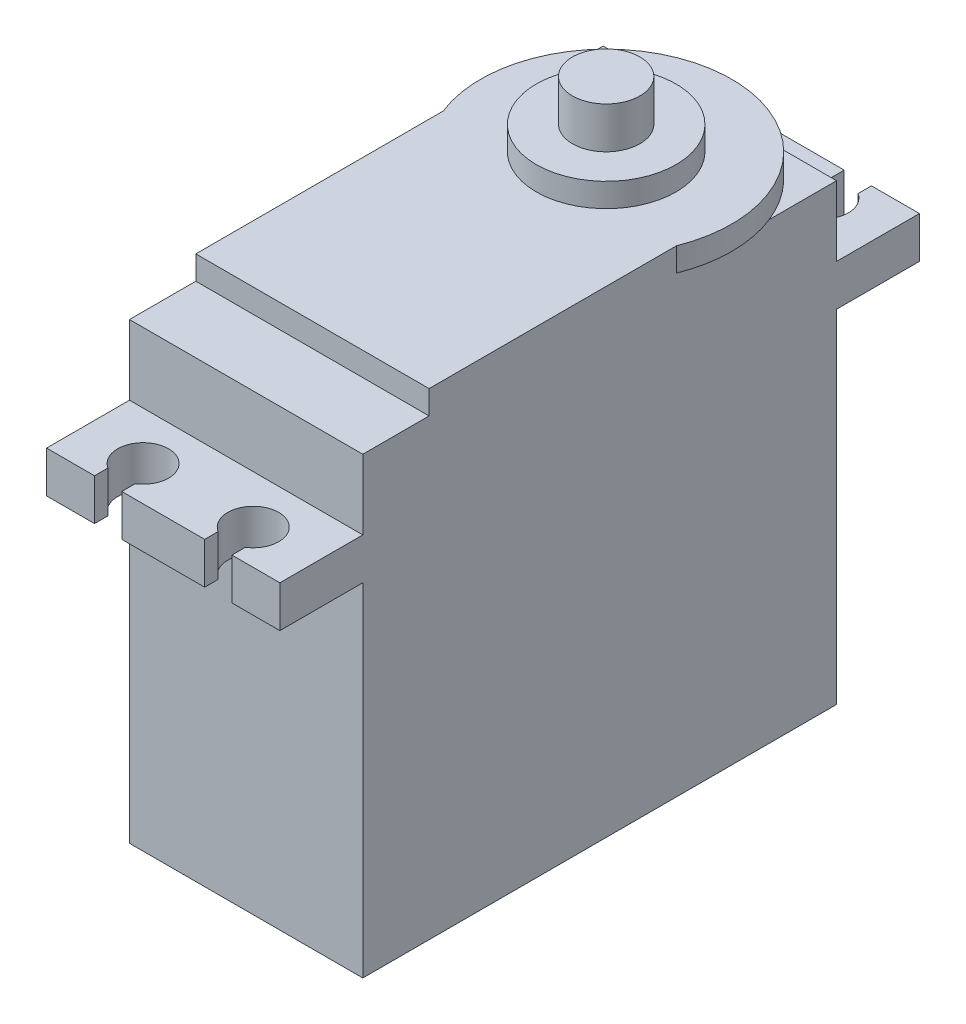
ISO-10303-21;
HEADER;
FILE_DESCRIPTION(('STEP AP214'),'2;1');
FILE_NAME('part.step','',(''),(''),'','','');
FILE_SCHEMA(('AUTOMOTIVE_DESIGN { 1 0 10303 214 1 1 1 1 }'));
ENDSEC;
DATA;
#1=APPLICATION_CONTEXT('core data for automotive mechanical design processes');
#2=APPLICATION_PROTOCOL_DEFINITION('international standard','automotive_design',2000,#1);
#3=PRODUCT_CONTEXT('',#1,'mechanical');
#4=PRODUCT('Part','Part','',(#3));
#5=PRODUCT_RELATED_PRODUCT_CATEGORY('part','',(#4));
#6=PRODUCT_DEFINITION_FORMATION('','',#4);
#7=PRODUCT_DEFINITION_CONTEXT('part definition',#1,'design');
#8=PRODUCT_DEFINITION('design','',#6,#7);
#9=PRODUCT_DEFINITION_SHAPE('','',#8);
#10=(LENGTH_UNIT() NAMED_UNIT(*) SI_UNIT(.MILLI.,.METRE.));
#11=(NAMED_UNIT(*) PLANE_ANGLE_UNIT() SI_UNIT($,.RADIAN.));
#12=(NAMED_UNIT(*) SI_UNIT($,.STERADIAN.) SOLID_ANGLE_UNIT());
#13=UNCERTAINTY_MEASURE_WITH_UNIT(LENGTH_MEASURE(1.E-05),#10,'distance_accuracy_value','');
#14=(GEOMETRIC_REPRESENTATION_CONTEXT(3) GLOBAL_UNCERTAINTY_ASSIGNED_CONTEXT((#13)) GLOBAL_UNIT_ASSIGNED_CONTEXT((#10,
#11,#12)) REPRESENTATION_CONTEXT('',''));
#15=CARTESIAN_POINT('',(0.,0.,0.));
#16=DIRECTION('',(0.,0.,1.));
#17=DIRECTION('',(1.,0.,0.));
#18=AXIS2_PLACEMENT_3D('',#15,#16,#17);
#19=CARTESIAN_POINT('',(19.7,0.,-40.));
#20=DIRECTION('',(0.,0.,1.));
#21=DIRECTION('',(1.,0.,0.));
#22=AXIS2_PLACEMENT_3D('',#19,#20,#21);
#23=PLANE('',#22);
#24=DIRECTION('',(1.,0.,0.));
#25=VECTOR('',#24,1.);
#26=CARTESIAN_POINT('',(0.,28.9,-40.));
#27=LINE('',#26,#25);
#28=CARTESIAN_POINT('',(0.,28.9,-40.));
#29=VERTEX_POINT('',#28);
#30=CARTESIAN_POINT('',(19.7,28.9,-40.));
#31=VERTEX_POINT('',#30);
#32=EDGE_CURVE('E66',#29,#31,#27,.T.);
#33=ORIENTED_EDGE('',*,*,#32,.T.);
#34=DIRECTION('',(0.,1.,0.));
#35=VECTOR('',#34,1.);
#36=CARTESIAN_POINT('',(19.7,0.,-40.));
#37=LINE('',#36,#35);
#38=CARTESIAN_POINT('',(19.7,0.,-40.));
#39=VERTEX_POINT('',#38);
#40=EDGE_CURVE('E290',#39,#31,#37,.T.);
#41=ORIENTED_EDGE('',*,*,#40,.F.);
#42=DIRECTION('',(-1.,0.,0.));
#43=VECTOR('',#42,1.);
#44=CARTESIAN_POINT('',(19.7,0.,-40.));
#45=LINE('',#44,#43);
#46=CARTESIAN_POINT('',(0.,0.,-40.));
#47=VERTEX_POINT('',#46);
#48=EDGE_CURVE('E527',#39,#47,#45,.T.);
#49=ORIENTED_EDGE('',*,*,#48,.T.);
#50=DIRECTION('',(0.,1.,0.));
#51=VECTOR('',#50,1.);
#52=CARTESIAN_POINT('',(0.,0.,-40.));
#53=LINE('',#52,#51);
#54=EDGE_CURVE('E515',#47,#29,#53,.T.);
#55=ORIENTED_EDGE('',*,*,#54,.T.);
#56=EDGE_LOOP('',(#33,#41,#49,#55));
#57=FACE_BOUND('',#56,.T.);
#58=ADVANCED_FACE('F41',(#57),#23,.F.);
#59=CARTESIAN_POINT('',(19.7,0.,0.));
#60=DIRECTION('',(0.,0.,-1.));
#61=DIRECTION('',(-1.,0.,0.));
#62=AXIS2_PLACEMENT_3D('',#59,#60,#61);
#63=PLANE('',#62);
#64=DIRECTION('',(-1.,0.,0.));
#65=VECTOR('',#64,1.);
#66=CARTESIAN_POINT('',(0.,32.4,0.));
#67=LINE('',#66,#65);
#68=CARTESIAN_POINT('',(19.7,32.4,0.));
#69=VERTEX_POINT('',#68);
#70=CARTESIAN_POINT('',(0.,32.4,0.));
#71=VERTEX_POINT('',#70);
#72=EDGE_CURVE('E372',#69,#71,#67,.T.);
#73=ORIENTED_EDGE('',*,*,#72,.F.);
#74=DIRECTION('',(0.,-1.,0.));
#75=VECTOR('',#74,1.);
#76=CARTESIAN_POINT('',(19.7,0.,0.));
#77=LINE('',#76,#75);
#78=CARTESIAN_POINT('',(19.7,38.3,0.));
#79=VERTEX_POINT('',#78);
#80=EDGE_CURVE('E497',#79,#69,#77,.T.);
#81=ORIENTED_EDGE('',*,*,#80,.F.);
#82=DIRECTION('',(-1.,0.,0.));
#83=VECTOR('',#82,1.);
#84=CARTESIAN_POINT('',(19.7,38.3,0.));
#85=LINE('',#84,#83);
#86=CARTESIAN_POINT('',(0.,38.3,0.));
#87=VERTEX_POINT('',#86);
#88=EDGE_CURVE('E507',#79,#87,#85,.T.);
#89=ORIENTED_EDGE('',*,*,#88,.T.);
#90=DIRECTION('',(0.,-1.,0.));
#91=VECTOR('',#90,1.);
#92=CARTESIAN_POINT('',(0.,0.,0.));
#93=LINE('',#92,#91);
#94=EDGE_CURVE('E509',#87,#71,#93,.T.);
#95=ORIENTED_EDGE('',*,*,#94,.T.);
#96=EDGE_LOOP('',(#73,#81,#89,#95));
#97=FACE_BOUND('',#96,.T.);
#98=ADVANCED_FACE('F570',(#97),#63,.F.);
#99=CARTESIAN_POINT('',(19.7,38.3,0.));
#100=DIRECTION('',(0.,-1.,0.));
#101=DIRECTION('',(0.,0.,-1.));
#102=AXIS2_PLACEMENT_3D('',#99,#100,#101);
#103=PLANE('',#102);
#104=CARTESIAN_POINT('',(9.85,38.3,-30.4));
#105=DIRECTION('',(0.,1.,0.));
#106=DIRECTION('',(0.,0.,1.));
#107=AXIS2_PLACEMENT_3D('',#104,#105,#106);
#108=CIRCLE('',#107,10.6);
#109=CARTESIAN_POINT('',(19.7,38.3,-34.3163120406832));
#110=VERTEX_POINT('',#109);
#111=CARTESIAN_POINT('',(14.3444410108488,38.3,-40.));
#112=VERTEX_POINT('',#111);
#113=EDGE_CURVE('E50',#110,#112,#108,.T.);
#114=ORIENTED_EDGE('',*,*,#113,.F.);
#115=DIRECTION('',(0.,0.,1.));
#116=VECTOR('',#115,1.);
#117=CARTESIAN_POINT('',(19.7,38.3,0.));
#118=LINE('',#117,#116);
#119=CARTESIAN_POINT('',(19.7,38.3,-40.));
#120=VERTEX_POINT('',#119);
#121=EDGE_CURVE('E504',#120,#110,#118,.T.);
#122=ORIENTED_EDGE('',*,*,#121,.F.);
#123=DIRECTION('',(-1.,0.,0.));
#124=VECTOR('',#123,1.);
#125=CARTESIAN_POINT('',(19.7,38.3,-40.));
#126=LINE('',#125,#124);
#127=EDGE_CURVE('E525',#120,#112,#126,.T.);
#128=ORIENTED_EDGE('',*,*,#127,.T.);
#129=EDGE_LOOP('',(#114,#122,#128));
#130=FACE_BOUND('',#129,.T.);
#131=ADVANCED_FACE('F624',(#130),#103,.F.);
#132=CARTESIAN_POINT('',(5.35555898915117,38.3,-40.));
#133=VERTEX_POINT('',#132);
#134=CARTESIAN_POINT('',(0.,38.3,-34.3163120406832));
#135=VERTEX_POINT('',#134);
#136=EDGE_CURVE('E484',#133,#135,#108,.T.);
#137=ORIENTED_EDGE('',*,*,#136,.F.);
#138=CARTESIAN_POINT('',(0.,38.3,-40.));
#139=VERTEX_POINT('',#138);
#140=EDGE_CURVE('E524',#133,#139,#126,.T.);
#141=ORIENTED_EDGE('',*,*,#140,.T.);
#142=DIRECTION('',(0.,0.,1.));
#143=VECTOR('',#142,1.);
#144=CARTESIAN_POINT('',(0.,38.3,0.));
#145=LINE('',#144,#143);
#146=EDGE_CURVE('E518',#139,#135,#145,.T.);
#147=ORIENTED_EDGE('',*,*,#146,.T.);
#148=EDGE_LOOP('',(#137,#141,#147));
#149=FACE_BOUND('',#148,.T.);
#150=ADVANCED_FACE('F638',(#149),#103,.F.);
#151=DIRECTION('',(1.,0.,0.));
#152=VECTOR('',#151,1.);
#153=CARTESIAN_POINT('',(0.,38.3,-5.6));
#154=LINE('',#153,#152);
#155=CARTESIAN_POINT('',(0.,38.3,-5.6));
#156=VERTEX_POINT('',#155);
#157=CARTESIAN_POINT('',(19.7,38.3,-5.6));
#158=VERTEX_POINT('',#157);
#159=EDGE_CURVE('E464',#156,#158,#154,.T.);
#160=ORIENTED_EDGE('',*,*,#159,.F.);
#161=EDGE_CURVE('E517',#156,#87,#145,.T.);
#162=ORIENTED_EDGE('',*,*,#161,.T.);
#163=ORIENTED_EDGE('',*,*,#88,.F.);
#164=EDGE_CURVE('E503',#158,#79,#118,.T.);
#165=ORIENTED_EDGE('',*,*,#164,.F.);
#166=EDGE_LOOP('',(#160,#162,#163,#165));
#167=FACE_BOUND('',#166,.T.);
#168=ADVANCED_FACE('F567',(#167),#103,.F.);
#169=CARTESIAN_POINT('',(19.7,28.9,0.));
#170=VERTEX_POINT('',#169);
#171=CARTESIAN_POINT('',(19.7,0.,0.));
#172=VERTEX_POINT('',#171);
#173=EDGE_CURVE('E500',#170,#172,#77,.T.);
#174=ORIENTED_EDGE('',*,*,#173,.F.);
#175=DIRECTION('',(-1.,0.,0.));
#176=VECTOR('',#175,1.);
#177=CARTESIAN_POINT('',(0.,28.9,0.));
#178=LINE('',#177,#176);
#179=CARTESIAN_POINT('',(0.,28.9,0.));
#180=VERTEX_POINT('',#179);
#181=EDGE_CURVE('E401',#170,#180,#178,.T.);
#182=ORIENTED_EDGE('',*,*,#181,.T.);
#183=CARTESIAN_POINT('',(0.,0.,0.));
#184=VERTEX_POINT('',#183);
#185=EDGE_CURVE('E496',#180,#184,#93,.T.);
#186=ORIENTED_EDGE('',*,*,#185,.T.);
#187=DIRECTION('',(-1.,0.,0.));
#188=VECTOR('',#187,1.);
#189=CARTESIAN_POINT('',(19.7,0.,0.));
#190=LINE('',#189,#188);
#191=EDGE_CURVE('E45',#172,#184,#190,.T.);
#192=ORIENTED_EDGE('',*,*,#191,.F.);
#193=EDGE_LOOP('',(#174,#182,#186,#192));
#194=FACE_BOUND('',#193,.T.);
#195=ADVANCED_FACE('F43',(#194),#63,.F.);
#196=CARTESIAN_POINT('',(19.7,0.,0.));
#197=DIRECTION('',(0.,1.,0.));
#198=DIRECTION('',(0.,0.,1.));
#199=AXIS2_PLACEMENT_3D('',#196,#197,#198);
#200=PLANE('',#199);
#201=DIRECTION('',(0.,0.,-1.));
#202=VECTOR('',#201,1.);
#203=CARTESIAN_POINT('',(0.,0.,0.));
#204=LINE('',#203,#202);
#205=EDGE_CURVE('E512',#184,#47,#204,.T.);
#206=ORIENTED_EDGE('',*,*,#205,.T.);
#207=ORIENTED_EDGE('',*,*,#48,.F.);
#208=DIRECTION('',(0.,0.,-1.));
#209=VECTOR('',#208,1.);
#210=CARTESIAN_POINT('',(19.7,0.,0.));
#211=LINE('',#210,#209);
#212=EDGE_CURVE('E499',#172,#39,#211,.T.);
#213=ORIENTED_EDGE('',*,*,#212,.F.);
#214=ORIENTED_EDGE('',*,*,#191,.T.);
#215=EDGE_LOOP('',(#206,#207,#213,#214));
#216=FACE_BOUND('',#215,.T.);
#217=ADVANCED_FACE('F617',(#216),#200,.F.);
#218=CARTESIAN_POINT('',(19.7,32.4,-40.));
#219=VERTEX_POINT('',#218);
#220=EDGE_CURVE('E58',#219,#120,#37,.T.);
#221=ORIENTED_EDGE('',*,*,#220,.F.);
#222=DIRECTION('',(1.,0.,0.));
#223=VECTOR('',#222,1.);
#224=CARTESIAN_POINT('',(0.,32.4,-40.));
#225=LINE('',#224,#223);
#226=CARTESIAN_POINT('',(0.,32.4,-40.));
#227=VERTEX_POINT('',#226);
#228=EDGE_CURVE('E320',#227,#219,#225,.T.);
#229=ORIENTED_EDGE('',*,*,#228,.F.);
#230=EDGE_CURVE('E514',#227,#139,#53,.T.);
#231=ORIENTED_EDGE('',*,*,#230,.T.);
#232=ORIENTED_EDGE('',*,*,#140,.F.);
#233=EDGE_CURVE('E528',#112,#133,#126,.T.);
#234=ORIENTED_EDGE('',*,*,#233,.F.);
#235=ORIENTED_EDGE('',*,*,#127,.F.);
#236=EDGE_LOOP('',(#221,#229,#231,#232,#234,#235));
#237=FACE_BOUND('',#236,.T.);
#238=ADVANCED_FACE('F620',(#237),#23,.F.);
#239=CARTESIAN_POINT('',(19.7,0.,0.));
#240=DIRECTION('',(-1.,0.,0.));
#241=DIRECTION('',(0.,0.,1.));
#242=AXIS2_PLACEMENT_3D('',#239,#240,#241);
#243=PLANE('',#242);
#244=ORIENTED_EDGE('',*,*,#80,.T.);
#245=DIRECTION('',(0.,0.,-1.));
#246=VECTOR('',#245,1.);
#247=CARTESIAN_POINT('',(19.7,32.4,0.));
#248=LINE('',#247,#246);
#249=CARTESIAN_POINT('',(19.7,32.4,7.));
#250=VERTEX_POINT('',#249);
#251=EDGE_CURVE('E434',#250,#69,#248,.T.);
#252=ORIENTED_EDGE('',*,*,#251,.F.);
#253=DIRECTION('',(0.,1.,0.));
#254=VECTOR('',#253,1.);
#255=CARTESIAN_POINT('',(19.7,28.9,7.));
#256=LINE('',#255,#254);
#257=CARTESIAN_POINT('',(19.7,28.9,7.));
#258=VERTEX_POINT('',#257);
#259=EDGE_CURVE('E438',#258,#250,#256,.T.);
#260=ORIENTED_EDGE('',*,*,#259,.F.);
#261=DIRECTION('',(0.,0.,-1.));
#262=VECTOR('',#261,1.);
#263=CARTESIAN_POINT('',(19.7,28.9,0.));
#264=LINE('',#263,#262);
#265=EDGE_CURVE('E399',#258,#170,#264,.T.);
#266=ORIENTED_EDGE('',*,*,#265,.T.);
#267=ORIENTED_EDGE('',*,*,#173,.T.);
#268=ORIENTED_EDGE('',*,*,#212,.T.);
#269=ORIENTED_EDGE('',*,*,#40,.T.);
#270=DIRECTION('',(0.,0.,-1.));
#271=VECTOR('',#270,1.);
#272=CARTESIAN_POINT('',(19.7,28.9,-40.));
#273=LINE('',#272,#271);
#274=CARTESIAN_POINT('',(19.7,28.9,-47.));
#275=VERTEX_POINT('',#274);
#276=EDGE_CURVE('E283',#31,#275,#273,.T.);
#277=ORIENTED_EDGE('',*,*,#276,.T.);
#278=DIRECTION('',(0.,1.,0.));
#279=VECTOR('',#278,1.);
#280=CARTESIAN_POINT('',(19.7,28.9,-47.));
#281=LINE('',#280,#279);
#282=CARTESIAN_POINT('',(19.7,32.4,-47.));
#283=VERTEX_POINT('',#282);
#284=EDGE_CURVE('E266',#275,#283,#281,.T.);
#285=ORIENTED_EDGE('',*,*,#284,.T.);
#286=DIRECTION('',(0.,0.,-1.));
#287=VECTOR('',#286,1.);
#288=CARTESIAN_POINT('',(19.7,32.4,-40.));
#289=LINE('',#288,#287);
#290=EDGE_CURVE('E323',#219,#283,#289,.T.);
#291=ORIENTED_EDGE('',*,*,#290,.F.);
#292=ORIENTED_EDGE('',*,*,#220,.T.);
#293=ORIENTED_EDGE('',*,*,#121,.T.);
#294=CARTESIAN_POINT('',(19.7,38.3,-26.4836879593168));
#295=VERTEX_POINT('',#294);
#296=EDGE_CURVE('E508',#110,#295,#118,.T.);
#297=ORIENTED_EDGE('',*,*,#296,.T.);
#298=DIRECTION('',(0.,-1.,0.));
#299=VECTOR('',#298,1.);
#300=CARTESIAN_POINT('',(19.7,40.3,-26.4836879593168));
#301=LINE('',#300,#299);
#302=CARTESIAN_POINT('',(19.7,40.3,-26.4836879593168));
#303=VERTEX_POINT('',#302);
#304=EDGE_CURVE('E487',#303,#295,#301,.T.);
#305=ORIENTED_EDGE('',*,*,#304,.F.);
#306=DIRECTION('',(0.,0.,-1.));
#307=VECTOR('',#306,1.);
#308=CARTESIAN_POINT('',(19.7,40.3,-5.6));
#309=LINE('',#308,#307);
#310=CARTESIAN_POINT('',(19.7,40.3,-5.6));
#311=VERTEX_POINT('',#310);
#312=EDGE_CURVE('E473',#311,#303,#309,.T.);
#313=ORIENTED_EDGE('',*,*,#312,.F.);
#314=DIRECTION('',(0.,-1.,0.));
#315=VECTOR('',#314,1.);
#316=CARTESIAN_POINT('',(19.7,40.3,-5.6));
#317=LINE('',#316,#315);
#318=EDGE_CURVE('E490',#311,#158,#317,.T.);
#319=ORIENTED_EDGE('',*,*,#318,.T.);
#320=ORIENTED_EDGE('',*,*,#164,.T.);
#321=EDGE_LOOP('',(#244,#252,#260,#266,#267,#268,#269,#277,#285,#291,#292,#293,#297,#305,#313,
#319,#320));
#322=FACE_BOUND('',#321,.T.);
#323=ADVANCED_FACE('F289',(#322),#243,.F.);
#324=CARTESIAN_POINT('',(0.,0.,0.));
#325=DIRECTION('',(-1.,0.,0.));
#326=DIRECTION('',(0.,0.,1.));
#327=AXIS2_PLACEMENT_3D('',#324,#325,#326);
#328=PLANE('',#327);
#329=ORIENTED_EDGE('',*,*,#94,.F.);
#330=ORIENTED_EDGE('',*,*,#161,.F.);
#331=DIRECTION('',(0.,-1.,0.));
#332=VECTOR('',#331,1.);
#333=CARTESIAN_POINT('',(0.,40.3,-5.6));
#334=LINE('',#333,#332);
#335=CARTESIAN_POINT('',(0.,40.3,-5.6));
#336=VERTEX_POINT('',#335);
#337=EDGE_CURVE('E493',#336,#156,#334,.T.);
#338=ORIENTED_EDGE('',*,*,#337,.F.);
#339=DIRECTION('',(0.,0.,1.));
#340=VECTOR('',#339,1.);
#341=CARTESIAN_POINT('',(0.,40.3,-5.6));
#342=LINE('',#341,#340);
#343=CARTESIAN_POINT('',(0.,40.3,-26.4836879593168));
#344=VERTEX_POINT('',#343);
#345=EDGE_CURVE('E467',#344,#336,#342,.T.);
#346=ORIENTED_EDGE('',*,*,#345,.F.);
#347=DIRECTION('',(0.,-1.,0.));
#348=VECTOR('',#347,1.);
#349=CARTESIAN_POINT('',(0.,40.3,-26.4836879593168));
#350=LINE('',#349,#348);
#351=CARTESIAN_POINT('',(0.,38.3,-26.4836879593168));
#352=VERTEX_POINT('',#351);
#353=EDGE_CURVE('E477',#344,#352,#350,.T.);
#354=ORIENTED_EDGE('',*,*,#353,.T.);
#355=EDGE_CURVE('E521',#135,#352,#145,.T.);
#356=ORIENTED_EDGE('',*,*,#355,.F.);
#357=ORIENTED_EDGE('',*,*,#146,.F.);
#358=ORIENTED_EDGE('',*,*,#230,.F.);
#359=DIRECTION('',(0.,0.,1.));
#360=VECTOR('',#359,1.);
#361=CARTESIAN_POINT('',(0.,32.4,-40.));
#362=LINE('',#361,#360);
#363=CARTESIAN_POINT('',(0.,32.4,-47.));
#364=VERTEX_POINT('',#363);
#365=EDGE_CURVE('E317',#364,#227,#362,.T.);
#366=ORIENTED_EDGE('',*,*,#365,.F.);
#367=DIRECTION('',(0.,1.,0.));
#368=VECTOR('',#367,1.);
#369=CARTESIAN_POINT('',(0.,28.9,-47.));
#370=LINE('',#369,#368);
#371=CARTESIAN_POINT('',(0.,28.9,-47.));
#372=VERTEX_POINT('',#371);
#373=EDGE_CURVE('E350',#372,#364,#370,.T.);
#374=ORIENTED_EDGE('',*,*,#373,.F.);
#375=DIRECTION('',(0.,0.,1.));
#376=VECTOR('',#375,1.);
#377=CARTESIAN_POINT('',(0.,28.9,-40.));
#378=LINE('',#377,#376);
#379=EDGE_CURVE('E292',#372,#29,#378,.T.);
#380=ORIENTED_EDGE('',*,*,#379,.T.);
#381=ORIENTED_EDGE('',*,*,#54,.F.);
#382=ORIENTED_EDGE('',*,*,#205,.F.);
#383=ORIENTED_EDGE('',*,*,#185,.F.);
#384=DIRECTION('',(0.,0.,1.));
#385=VECTOR('',#384,1.);
#386=CARTESIAN_POINT('',(0.,28.9,0.));
#387=LINE('',#386,#385);
#388=CARTESIAN_POINT('',(0.,28.9,7.));
#389=VERTEX_POINT('',#388);
#390=EDGE_CURVE('E368',#180,#389,#387,.T.);
#391=ORIENTED_EDGE('',*,*,#390,.T.);
#392=DIRECTION('',(0.,1.,0.));
#393=VECTOR('',#392,1.);
#394=CARTESIAN_POINT('',(0.,28.9,7.));
#395=LINE('',#394,#393);
#396=CARTESIAN_POINT('',(0.,32.4,7.));
#397=VERTEX_POINT('',#396);
#398=EDGE_CURVE('E404',#389,#397,#395,.T.);
#399=ORIENTED_EDGE('',*,*,#398,.T.);
#400=DIRECTION('',(0.,0.,1.));
#401=VECTOR('',#400,1.);
#402=CARTESIAN_POINT('',(0.,32.4,0.));
#403=LINE('',#402,#401);
#404=EDGE_CURVE('E352',#71,#397,#403,.T.);
#405=ORIENTED_EDGE('',*,*,#404,.F.);
#406=EDGE_LOOP('',(#329,#330,#338,#346,#354,#356,#357,#358,#366,#374,#380,#381,#382,#383,#391,
#399,#405));
#407=FACE_BOUND('',#406,.T.);
#408=ADVANCED_FACE('F550',(#407),#328,.T.);
#409=CARTESIAN_POINT('',(9.85,38.3,-30.4));
#410=DIRECTION('',(0.,1.,0.));
#411=DIRECTION('',(0.,0.,1.));
#412=AXIS2_PLACEMENT_3D('',#409,#410,#411);
#413=PLANE('',#412);
#414=EDGE_CURVE('E480',#135,#352,#108,.T.);
#415=ORIENTED_EDGE('',*,*,#414,.F.);
#416=ORIENTED_EDGE('',*,*,#355,.T.);
#417=EDGE_LOOP('',(#415,#416));
#418=FACE_BOUND('',#417,.T.);
#419=ADVANCED_FACE('F739',(#418),#413,.F.);
#420=EDGE_CURVE('E483',#112,#133,#108,.T.);
#421=ORIENTED_EDGE('',*,*,#420,.F.);
#422=ORIENTED_EDGE('',*,*,#233,.T.);
#423=EDGE_LOOP('',(#421,#422));
#424=FACE_BOUND('',#423,.T.);
#425=ADVANCED_FACE('F740',(#424),#413,.F.);
#426=CARTESIAN_POINT('',(0.,40.3,-5.6));
#427=DIRECTION('',(0.,0.,-1.));
#428=DIRECTION('',(-1.,0.,0.));
#429=AXIS2_PLACEMENT_3D('',#426,#427,#428);
#430=PLANE('',#429);
#431=ORIENTED_EDGE('',*,*,#159,.T.);
#432=ORIENTED_EDGE('',*,*,#318,.F.);
#433=DIRECTION('',(1.,0.,0.));
#434=VECTOR('',#433,1.);
#435=CARTESIAN_POINT('',(0.,40.3,-5.6));
#436=LINE('',#435,#434);
#437=EDGE_CURVE('E470',#336,#311,#436,.T.);
#438=ORIENTED_EDGE('',*,*,#437,.F.);
#439=ORIENTED_EDGE('',*,*,#337,.T.);
#440=EDGE_LOOP('',(#431,#432,#438,#439));
#441=FACE_BOUND('',#440,.T.);
#442=ADVANCED_FACE('F743',(#441),#430,.F.);
#443=CARTESIAN_POINT('',(9.85,40.3,-30.4));
#444=DIRECTION('',(0.,-1.,0.));
#445=DIRECTION('',(0.,0.,-1.));
#446=AXIS2_PLACEMENT_3D('',#443,#444,#445);
#447=CYLINDRICAL_SURFACE('',#446,10.6);
#448=EDGE_CURVE('E471',#295,#110,#108,.T.);
#449=ORIENTED_EDGE('',*,*,#448,.T.);
#450=ORIENTED_EDGE('',*,*,#113,.T.);
#451=ORIENTED_EDGE('',*,*,#420,.T.);
#452=ORIENTED_EDGE('',*,*,#136,.T.);
#453=ORIENTED_EDGE('',*,*,#414,.T.);
#454=ORIENTED_EDGE('',*,*,#353,.F.);
#455=CARTESIAN_POINT('',(9.85,40.3,-30.4));
#456=DIRECTION('',(0.,1.,0.));
#457=DIRECTION('',(0.,0.,1.));
#458=AXIS2_PLACEMENT_3D('',#455,#456,#457);
#459=CIRCLE('',#458,10.6);
#460=EDGE_CURVE('E475',#303,#344,#459,.T.);
#461=ORIENTED_EDGE('',*,*,#460,.F.);
#462=ORIENTED_EDGE('',*,*,#304,.T.);
#463=EDGE_LOOP('',(#449,#450,#451,#452,#453,#454,#461,#462));
#464=FACE_BOUND('',#463,.T.);
#465=ADVANCED_FACE('F544',(#464),#447,.T.);
#466=CARTESIAN_POINT('',(9.85,40.3,-30.4));
#467=DIRECTION('',(0.,1.,0.));
#468=DIRECTION('',(0.,0.,1.));
#469=AXIS2_PLACEMENT_3D('',#466,#467,#468);
#470=PLANE('',#469);
#471=CARTESIAN_POINT('',(9.85,40.3,-30.4));
#472=DIRECTION('',(0.,1.,0.));
#473=DIRECTION('',(0.,0.,1.));
#474=AXIS2_PLACEMENT_3D('',#471,#472,#473);
#475=CIRCLE('',#474,5.9);
#476=CARTESIAN_POINT('',(9.85,40.3,-24.5));
#477=VERTEX_POINT('',#476);
#478=EDGE_CURVE('E459',#477,#477,#475,.T.);
#479=ORIENTED_EDGE('',*,*,#478,.F.);
#480=EDGE_LOOP('',(#479));
#481=FACE_BOUND('',#480,.T.);
#482=ORIENTED_EDGE('',*,*,#345,.T.);
#483=ORIENTED_EDGE('',*,*,#437,.T.);
#484=ORIENTED_EDGE('',*,*,#312,.T.);
#485=ORIENTED_EDGE('',*,*,#460,.T.);
#486=EDGE_LOOP('',(#482,#483,#484,#485));
#487=FACE_BOUND('',#486,.T.);
#488=ADVANCED_FACE('F555',(#481,#487),#470,.T.);
#489=ORIENTED_EDGE('',*,*,#296,.F.);
#490=ORIENTED_EDGE('',*,*,#448,.F.);
#491=EDGE_LOOP('',(#489,#490));
#492=FACE_BOUND('',#491,.T.);
#493=ADVANCED_FACE('F562',(#492),#413,.F.);
#494=CARTESIAN_POINT('',(9.85,42.3,-30.4));
#495=DIRECTION('',(0.,-1.,0.));
#496=DIRECTION('',(0.,0.,-1.));
#497=AXIS2_PLACEMENT_3D('',#494,#495,#496);
#498=CYLINDRICAL_SURFACE('',#497,5.9);
#499=CARTESIAN_POINT('',(9.85,42.3,-30.4));
#500=DIRECTION('',(0.,1.,0.));
#501=DIRECTION('',(0.,0.,1.));
#502=AXIS2_PLACEMENT_3D('',#499,#500,#501);
#503=CIRCLE('',#502,5.9);
#504=CARTESIAN_POINT('',(9.85,42.3,-24.5));
#505=VERTEX_POINT('',#504);
#506=EDGE_CURVE('E461',#505,#505,#503,.T.);
#507=ORIENTED_EDGE('',*,*,#506,.F.);
#508=EDGE_LOOP('',(#507));
#509=FACE_BOUND('',#508,.T.);
#510=ORIENTED_EDGE('',*,*,#478,.T.);
#511=EDGE_LOOP('',(#510));
#512=FACE_BOUND('',#511,.T.);
#513=ADVANCED_FACE('F729',(#509,#512),#498,.T.);
#514=CARTESIAN_POINT('',(9.85,42.3,-30.4));
#515=DIRECTION('',(0.,1.,0.));
#516=DIRECTION('',(0.,0.,1.));
#517=AXIS2_PLACEMENT_3D('',#514,#515,#516);
#518=PLANE('',#517);
#519=CARTESIAN_POINT('',(9.85,42.3,-30.4));
#520=DIRECTION('',(0.,1.,0.));
#521=DIRECTION('',(0.,0.,1.));
#522=AXIS2_PLACEMENT_3D('',#519,#520,#521);
#523=CIRCLE('',#522,2.85);
#524=CARTESIAN_POINT('',(9.85,42.3,-27.55));
#525=VERTEX_POINT('',#524);
#526=EDGE_CURVE('E11',#525,#525,#523,.T.);
#527=ORIENTED_EDGE('',*,*,#526,.F.);
#528=EDGE_LOOP('',(#527));
#529=FACE_BOUND('',#528,.T.);
#530=ORIENTED_EDGE('',*,*,#506,.T.);
#531=EDGE_LOOP('',(#530));
#532=FACE_BOUND('',#531,.T.);
#533=ADVANCED_FACE('F725',(#529,#532),#518,.T.);
#534=CARTESIAN_POINT('',(9.85,45.8,-30.4));
#535=DIRECTION('',(0.,-1.,0.));
#536=DIRECTION('',(0.,0.,-1.));
#537=AXIS2_PLACEMENT_3D('',#534,#535,#536);
#538=CYLINDRICAL_SURFACE('',#537,2.85);
#539=CARTESIAN_POINT('',(9.85,45.8,-30.4));
#540=DIRECTION('',(0.,1.,0.));
#541=DIRECTION('',(0.,0.,1.));
#542=AXIS2_PLACEMENT_3D('',#539,#540,#541);
#543=CIRCLE('',#542,2.85);
#544=CARTESIAN_POINT('',(9.85,45.8,-27.55));
#545=VERTEX_POINT('',#544);
#546=EDGE_CURVE('E440',#545,#545,#543,.T.);
#547=ORIENTED_EDGE('',*,*,#546,.F.);
#548=EDGE_LOOP('',(#547));
#549=FACE_BOUND('',#548,.T.);
#550=ORIENTED_EDGE('',*,*,#526,.T.);
#551=EDGE_LOOP('',(#550));
#552=FACE_BOUND('',#551,.T.);
#553=ADVANCED_FACE('F721',(#549,#552),#538,.T.);
#554=CARTESIAN_POINT('',(9.85,45.8,-30.4));
#555=DIRECTION('',(0.,1.,0.));
#556=DIRECTION('',(0.,0.,1.));
#557=AXIS2_PLACEMENT_3D('',#554,#555,#556);
#558=PLANE('',#557);
#559=ORIENTED_EDGE('',*,*,#546,.T.);
#560=EDGE_LOOP('',(#559));
#561=FACE_BOUND('',#560,.T.);
#562=ADVANCED_FACE('F702',(#561),#558,.T.);
#563=CARTESIAN_POINT('',(15.65,28.9,6.99999999999997));
#564=DIRECTION('',(0.,0.,1.));
#565=DIRECTION('',(1.,0.,0.));
#566=AXIS2_PLACEMENT_3D('',#563,#564,#565);
#567=PLANE('',#566);
#568=DIRECTION('',(1.,0.,0.));
#569=VECTOR('',#568,1.);
#570=CARTESIAN_POINT('',(15.65,32.4,6.99999999999997));
#571=LINE('',#570,#569);
#572=CARTESIAN_POINT('',(15.65,32.4,6.99999999999997));
#573=VERTEX_POINT('',#572);
#574=EDGE_CURVE('E431',#573,#250,#571,.T.);
#575=ORIENTED_EDGE('',*,*,#574,.F.);
#576=DIRECTION('',(0.,1.,0.));
#577=VECTOR('',#576,1.);
#578=CARTESIAN_POINT('',(15.65,28.9,6.99999999999997));
#579=LINE('',#578,#577);
#580=CARTESIAN_POINT('',(15.65,28.9,6.99999999999997));
#581=VERTEX_POINT('',#580);
#582=EDGE_CURVE('E441',#581,#573,#579,.T.);
#583=ORIENTED_EDGE('',*,*,#582,.F.);
#584=DIRECTION('',(1.,0.,0.));
#585=VECTOR('',#584,1.);
#586=CARTESIAN_POINT('',(15.65,28.9,6.99999999999997));
#587=LINE('',#586,#585);
#588=EDGE_CURVE('E396',#581,#258,#587,.T.);
#589=ORIENTED_EDGE('',*,*,#588,.T.);
#590=ORIENTED_EDGE('',*,*,#259,.T.);
#591=EDGE_LOOP('',(#575,#583,#589,#590));
#592=FACE_BOUND('',#591,.T.);
#593=ADVANCED_FACE('F582',(#592),#567,.T.);
#594=CARTESIAN_POINT('',(15.65,28.9,6.99999999999997));
#595=DIRECTION('',(-1.,0.,0.));
#596=DIRECTION('',(0.,0.,1.));
#597=AXIS2_PLACEMENT_3D('',#594,#595,#596);
#598=PLANE('',#597);
#599=DIRECTION('',(0.,0.,1.));
#600=VECTOR('',#599,1.);
#601=CARTESIAN_POINT('',(15.65,32.4,6.99999999999997));
#602=LINE('',#601,#600);
#603=CARTESIAN_POINT('',(15.65,32.4,5.86659021245847));
#604=VERTEX_POINT('',#603);
#605=EDGE_CURVE('E428',#604,#573,#602,.T.);
#606=ORIENTED_EDGE('',*,*,#605,.F.);
#607=DIRECTION('',(0.,1.,0.));
#608=VECTOR('',#607,1.);
#609=CARTESIAN_POINT('',(15.65,28.9,5.86659021245847));
#610=LINE('',#609,#608);
#611=CARTESIAN_POINT('',(15.65,28.9,5.86659021245847));
#612=VERTEX_POINT('',#611);
#613=EDGE_CURVE('E443',#612,#604,#610,.T.);
#614=ORIENTED_EDGE('',*,*,#613,.F.);
#615=DIRECTION('',(0.,0.,1.));
#616=VECTOR('',#615,1.);
#617=CARTESIAN_POINT('',(15.65,28.9,6.99999999999997));
#618=LINE('',#617,#616);
#619=EDGE_CURVE('E393',#612,#581,#618,.T.);
#620=ORIENTED_EDGE('',*,*,#619,.T.);
#621=ORIENTED_EDGE('',*,*,#582,.T.);
#622=EDGE_LOOP('',(#606,#614,#620,#621));
#623=FACE_BOUND('',#622,.T.);
#624=ADVANCED_FACE('F585',(#623),#598,.T.);
#625=CARTESIAN_POINT('',(14.5,28.9,4.04999999999997));
#626=DIRECTION('',(0.,1.,0.));
#627=DIRECTION('',(0.,0.,1.));
#628=AXIS2_PLACEMENT_3D('',#625,#626,#627);
#629=CYLINDRICAL_SURFACE('',#628,2.15);
#630=CARTESIAN_POINT('',(14.5,32.4,4.04999999999997));
#631=DIRECTION('',(0.,-1.,0.));
#632=DIRECTION('',(0.,0.,-1.));
#633=AXIS2_PLACEMENT_3D('',#630,#631,#632);
#634=CIRCLE('',#633,2.15);
#635=CARTESIAN_POINT('',(13.35,32.4,5.86659021245847));
#636=VERTEX_POINT('',#635);
#637=EDGE_CURVE('E425',#636,#604,#634,.T.);
#638=ORIENTED_EDGE('',*,*,#637,.F.);
#639=DIRECTION('',(0.,1.,0.));
#640=VECTOR('',#639,1.);
#641=CARTESIAN_POINT('',(13.35,28.9,5.86659021245847));
#642=LINE('',#641,#640);
#643=CARTESIAN_POINT('',(13.35,28.9,5.86659021245847));
#644=VERTEX_POINT('',#643);
#645=EDGE_CURVE('E445',#644,#636,#642,.T.);
#646=ORIENTED_EDGE('',*,*,#645,.F.);
#647=CARTESIAN_POINT('',(14.5,28.9,4.04999999999997));
#648=DIRECTION('',(0.,-1.,0.));
#649=DIRECTION('',(0.,0.,-1.));
#650=AXIS2_PLACEMENT_3D('',#647,#648,#649);
#651=CIRCLE('',#650,2.15);
#652=EDGE_CURVE('E390',#644,#612,#651,.T.);
#653=ORIENTED_EDGE('',*,*,#652,.T.);
#654=ORIENTED_EDGE('',*,*,#613,.T.);
#655=EDGE_LOOP('',(#638,#646,#653,#654));
#656=FACE_BOUND('',#655,.T.);
#657=ADVANCED_FACE('F590',(#656),#629,.F.);
#658=CARTESIAN_POINT('',(13.35,28.9,6.99999999999997));
#659=DIRECTION('',(1.,0.,0.));
#660=DIRECTION('',(0.,0.,-1.));
#661=AXIS2_PLACEMENT_3D('',#658,#659,#660);
#662=PLANE('',#661);
#663=DIRECTION('',(0.,0.,-1.));
#664=VECTOR('',#663,1.);
#665=CARTESIAN_POINT('',(13.35,32.4,6.99999999999997));
#666=LINE('',#665,#664);
#667=CARTESIAN_POINT('',(13.35,32.4,6.99999999999997));
#668=VERTEX_POINT('',#667);
#669=EDGE_CURVE('E422',#668,#636,#666,.T.);
#670=ORIENTED_EDGE('',*,*,#669,.F.);
#671=DIRECTION('',(0.,1.,0.));
#672=VECTOR('',#671,1.);
#673=CARTESIAN_POINT('',(13.35,28.9,6.99999999999997));
#674=LINE('',#673,#672);
#675=CARTESIAN_POINT('',(13.35,28.9,6.99999999999997));
#676=VERTEX_POINT('',#675);
#677=EDGE_CURVE('E447',#676,#668,#674,.T.);
#678=ORIENTED_EDGE('',*,*,#677,.F.);
#679=DIRECTION('',(0.,0.,-1.));
#680=VECTOR('',#679,1.);
#681=CARTESIAN_POINT('',(13.35,28.9,6.99999999999997));
#682=LINE('',#681,#680);
#683=EDGE_CURVE('E387',#676,#644,#682,.T.);
#684=ORIENTED_EDGE('',*,*,#683,.T.);
#685=ORIENTED_EDGE('',*,*,#645,.T.);
#686=EDGE_LOOP('',(#670,#678,#684,#685));
#687=FACE_BOUND('',#686,.T.);
#688=ADVANCED_FACE('F593',(#687),#662,.T.);
#689=CARTESIAN_POINT('',(6.35,28.9,7.));
#690=DIRECTION('',(0.,0.,1.));
#691=DIRECTION('',(1.,0.,0.));
#692=AXIS2_PLACEMENT_3D('',#689,#690,#691);
#693=PLANE('',#692);
#694=DIRECTION('',(1.,0.,0.));
#695=VECTOR('',#694,1.);
#696=CARTESIAN_POINT('',(6.35,32.4,7.));
#697=LINE('',#696,#695);
#698=CARTESIAN_POINT('',(6.35,32.4,7.));
#699=VERTEX_POINT('',#698);
#700=EDGE_CURVE('E419',#699,#668,#697,.T.);
#701=ORIENTED_EDGE('',*,*,#700,.F.);
#702=DIRECTION('',(0.,1.,0.));
#703=VECTOR('',#702,1.);
#704=CARTESIAN_POINT('',(6.35,28.9,7.));
#705=LINE('',#704,#703);
#706=CARTESIAN_POINT('',(6.35,28.9,7.));
#707=VERTEX_POINT('',#706);
#708=EDGE_CURVE('E449',#707,#699,#705,.T.);
#709=ORIENTED_EDGE('',*,*,#708,.F.);
#710=DIRECTION('',(1.,0.,0.));
#711=VECTOR('',#710,1.);
#712=CARTESIAN_POINT('',(6.35,28.9,7.));
#713=LINE('',#712,#711);
#714=EDGE_CURVE('E384',#707,#676,#713,.T.);
#715=ORIENTED_EDGE('',*,*,#714,.T.);
#716=ORIENTED_EDGE('',*,*,#677,.T.);
#717=EDGE_LOOP('',(#701,#709,#715,#716));
#718=FACE_BOUND('',#717,.T.);
#719=ADVANCED_FACE('F598',(#718),#693,.T.);
#720=CARTESIAN_POINT('',(6.35,28.9,7.));
#721=DIRECTION('',(-1.,0.,0.));
#722=DIRECTION('',(0.,0.,1.));
#723=AXIS2_PLACEMENT_3D('',#720,#721,#722);
#724=PLANE('',#723);
#725=DIRECTION('',(0.,0.,1.));
#726=VECTOR('',#725,1.);
#727=CARTESIAN_POINT('',(6.35,32.4,7.));
#728=LINE('',#727,#726);
#729=CARTESIAN_POINT('',(6.35,32.4,5.86659021245849));
#730=VERTEX_POINT('',#729);
#731=EDGE_CURVE('E416',#730,#699,#728,.T.);
#732=ORIENTED_EDGE('',*,*,#731,.F.);
#733=DIRECTION('',(0.,1.,0.));
#734=VECTOR('',#733,1.);
#735=CARTESIAN_POINT('',(6.35,28.9,5.86659021245849));
#736=LINE('',#735,#734);
#737=CARTESIAN_POINT('',(6.35,28.9,5.86659021245849));
#738=VERTEX_POINT('',#737);
#739=EDGE_CURVE('E451',#738,#730,#736,.T.);
#740=ORIENTED_EDGE('',*,*,#739,.F.);
#741=DIRECTION('',(0.,0.,1.));
#742=VECTOR('',#741,1.);
#743=CARTESIAN_POINT('',(6.35,28.9,7.));
#744=LINE('',#743,#742);
#745=EDGE_CURVE('E381',#738,#707,#744,.T.);
#746=ORIENTED_EDGE('',*,*,#745,.T.);
#747=ORIENTED_EDGE('',*,*,#708,.T.);
#748=EDGE_LOOP('',(#732,#740,#746,#747));
#749=FACE_BOUND('',#748,.T.);
#750=ADVANCED_FACE('F601',(#749),#724,.T.);
#751=CARTESIAN_POINT('',(5.2,28.9,4.05));
#752=DIRECTION('',(0.,1.,0.));
#753=DIRECTION('',(0.,0.,1.));
#754=AXIS2_PLACEMENT_3D('',#751,#752,#753);
#755=CYLINDRICAL_SURFACE('',#754,2.15);
#756=CARTESIAN_POINT('',(5.2,32.4,4.05));
#757=DIRECTION('',(0.,-1.,0.));
#758=DIRECTION('',(0.,0.,1.));
#759=AXIS2_PLACEMENT_3D('',#756,#757,#758);
#760=CIRCLE('',#759,2.15);
#761=CARTESIAN_POINT('',(4.05,32.4,5.86659021245849));
#762=VERTEX_POINT('',#761);
#763=EDGE_CURVE('E413',#762,#730,#760,.T.);
#764=ORIENTED_EDGE('',*,*,#763,.F.);
#765=DIRECTION('',(0.,1.,0.));
#766=VECTOR('',#765,1.);
#767=CARTESIAN_POINT('',(4.05,28.9,5.86659021245849));
#768=LINE('',#767,#766);
#769=CARTESIAN_POINT('',(4.05,28.9,5.86659021245849));
#770=VERTEX_POINT('',#769);
#771=EDGE_CURVE('E453',#770,#762,#768,.T.);
#772=ORIENTED_EDGE('',*,*,#771,.F.);
#773=CARTESIAN_POINT('',(5.2,28.9,4.05));
#774=DIRECTION('',(0.,-1.,0.));
#775=DIRECTION('',(0.,0.,1.));
#776=AXIS2_PLACEMENT_3D('',#773,#774,#775);
#777=CIRCLE('',#776,2.15);
#778=EDGE_CURVE('E378',#770,#738,#777,.T.);
#779=ORIENTED_EDGE('',*,*,#778,.T.);
#780=ORIENTED_EDGE('',*,*,#739,.T.);
#781=EDGE_LOOP('',(#764,#772,#779,#780));
#782=FACE_BOUND('',#781,.T.);
#783=ADVANCED_FACE('F606',(#782),#755,.F.);
#784=CARTESIAN_POINT('',(4.05,28.9,7.));
#785=DIRECTION('',(1.,0.,0.));
#786=DIRECTION('',(0.,0.,-1.));
#787=AXIS2_PLACEMENT_3D('',#784,#785,#786);
#788=PLANE('',#787);
#789=DIRECTION('',(0.,0.,-1.));
#790=VECTOR('',#789,1.);
#791=CARTESIAN_POINT('',(4.05,32.4,7.));
#792=LINE('',#791,#790);
#793=CARTESIAN_POINT('',(4.05,32.4,7.));
#794=VERTEX_POINT('',#793);
#795=EDGE_CURVE('E410',#794,#762,#792,.T.);
#796=ORIENTED_EDGE('',*,*,#795,.F.);
#797=DIRECTION('',(0.,1.,0.));
#798=VECTOR('',#797,1.);
#799=CARTESIAN_POINT('',(4.05,28.9,7.));
#800=LINE('',#799,#798);
#801=CARTESIAN_POINT('',(4.05,28.9,7.));
#802=VERTEX_POINT('',#801);
#803=EDGE_CURVE('E455',#802,#794,#800,.T.);
#804=ORIENTED_EDGE('',*,*,#803,.F.);
#805=DIRECTION('',(0.,0.,-1.));
#806=VECTOR('',#805,1.);
#807=CARTESIAN_POINT('',(4.05,28.9,7.));
#808=LINE('',#807,#806);
#809=EDGE_CURVE('E375',#802,#770,#808,.T.);
#810=ORIENTED_EDGE('',*,*,#809,.T.);
#811=ORIENTED_EDGE('',*,*,#771,.T.);
#812=EDGE_LOOP('',(#796,#804,#810,#811));
#813=FACE_BOUND('',#812,.T.);
#814=ADVANCED_FACE('F609',(#813),#788,.T.);
#815=CARTESIAN_POINT('',(0.,28.9,7.));
#816=DIRECTION('',(0.,0.,1.));
#817=DIRECTION('',(1.,0.,0.));
#818=AXIS2_PLACEMENT_3D('',#815,#816,#817);
#819=PLANE('',#818);
#820=DIRECTION('',(1.,0.,0.));
#821=VECTOR('',#820,1.);
#822=CARTESIAN_POINT('',(0.,32.4,7.));
#823=LINE('',#822,#821);
#824=EDGE_CURVE('E407',#397,#794,#823,.T.);
#825=ORIENTED_EDGE('',*,*,#824,.F.);
#826=ORIENTED_EDGE('',*,*,#398,.F.);
#827=DIRECTION('',(1.,0.,0.));
#828=VECTOR('',#827,1.);
#829=CARTESIAN_POINT('',(0.,28.9,7.));
#830=LINE('',#829,#828);
#831=EDGE_CURVE('E371',#389,#802,#830,.T.);
#832=ORIENTED_EDGE('',*,*,#831,.T.);
#833=ORIENTED_EDGE('',*,*,#803,.T.);
#834=EDGE_LOOP('',(#825,#826,#832,#833));
#835=FACE_BOUND('',#834,.T.);
#836=ADVANCED_FACE('F613',(#835),#819,.T.);
#837=CARTESIAN_POINT('',(5.2,28.9,4.05));
#838=DIRECTION('',(0.,1.,0.));
#839=DIRECTION('',(0.,0.,1.));
#840=AXIS2_PLACEMENT_3D('',#837,#838,#839);
#841=PLANE('',#840);
#842=ORIENTED_EDGE('',*,*,#390,.F.);
#843=ORIENTED_EDGE('',*,*,#181,.F.);
#844=ORIENTED_EDGE('',*,*,#265,.F.);
#845=ORIENTED_EDGE('',*,*,#588,.F.);
#846=ORIENTED_EDGE('',*,*,#619,.F.);
#847=ORIENTED_EDGE('',*,*,#652,.F.);
#848=ORIENTED_EDGE('',*,*,#683,.F.);
#849=ORIENTED_EDGE('',*,*,#714,.F.);
#850=ORIENTED_EDGE('',*,*,#745,.F.);
#851=ORIENTED_EDGE('',*,*,#778,.F.);
#852=ORIENTED_EDGE('',*,*,#809,.F.);
#853=ORIENTED_EDGE('',*,*,#831,.F.);
#854=EDGE_LOOP('',(#842,#843,#844,#845,#846,#847,#848,#849,#850,#851,#852,#853));
#855=FACE_BOUND('',#854,.T.);
#856=ADVANCED_FACE('F579',(#855),#841,.F.);
#857=CARTESIAN_POINT('',(5.2,32.4,4.05));
#858=DIRECTION('',(0.,1.,0.));
#859=DIRECTION('',(0.,0.,1.));
#860=AXIS2_PLACEMENT_3D('',#857,#858,#859);
#861=PLANE('',#860);
#862=ORIENTED_EDGE('',*,*,#404,.T.);
#863=ORIENTED_EDGE('',*,*,#824,.T.);
#864=ORIENTED_EDGE('',*,*,#795,.T.);
#865=ORIENTED_EDGE('',*,*,#763,.T.);
#866=ORIENTED_EDGE('',*,*,#731,.T.);
#867=ORIENTED_EDGE('',*,*,#700,.T.);
#868=ORIENTED_EDGE('',*,*,#669,.T.);
#869=ORIENTED_EDGE('',*,*,#637,.T.);
#870=ORIENTED_EDGE('',*,*,#605,.T.);
#871=ORIENTED_EDGE('',*,*,#574,.T.);
#872=ORIENTED_EDGE('',*,*,#251,.T.);
#873=ORIENTED_EDGE('',*,*,#72,.T.);
#874=EDGE_LOOP('',(#862,#863,#864,#865,#866,#867,#868,#869,#870,#871,#872,#873));
#875=FACE_BOUND('',#874,.T.);
#876=ADVANCED_FACE('F572',(#875),#861,.T.);
#877=CARTESIAN_POINT('',(0.,28.9,-47.));
#878=DIRECTION('',(0.,0.,-1.));
#879=DIRECTION('',(-1.,0.,0.));
#880=AXIS2_PLACEMENT_3D('',#877,#878,#879);
#881=PLANE('',#880);
#882=DIRECTION('',(-1.,0.,0.));
#883=VECTOR('',#882,1.);
#884=CARTESIAN_POINT('',(0.,32.4,-47.));
#885=LINE('',#884,#883);
#886=CARTESIAN_POINT('',(4.05,32.4,-47.));
#887=VERTEX_POINT('',#886);
#888=EDGE_CURVE('E347',#887,#364,#885,.T.);
#889=ORIENTED_EDGE('',*,*,#888,.F.);
#890=DIRECTION('',(0.,1.,0.));
#891=VECTOR('',#890,1.);
#892=CARTESIAN_POINT('',(4.05,28.9,-47.));
#893=LINE('',#892,#891);
#894=CARTESIAN_POINT('',(4.05,28.9,-47.));
#895=VERTEX_POINT('',#894);
#896=EDGE_CURVE('E353',#895,#887,#893,.T.);
#897=ORIENTED_EDGE('',*,*,#896,.F.);
#898=DIRECTION('',(-1.,0.,0.));
#899=VECTOR('',#898,1.);
#900=CARTESIAN_POINT('',(0.,28.9,-47.));
#901=LINE('',#900,#899);
#902=EDGE_CURVE('E276',#895,#372,#901,.T.);
#903=ORIENTED_EDGE('',*,*,#902,.T.);
#904=ORIENTED_EDGE('',*,*,#373,.T.);
#905=EDGE_LOOP('',(#889,#897,#903,#904));
#906=FACE_BOUND('',#905,.T.);
#907=ADVANCED_FACE('F659',(#906),#881,.T.);
#908=CARTESIAN_POINT('',(4.05,28.9,-47.));
#909=DIRECTION('',(1.,0.,0.));
#910=DIRECTION('',(0.,0.,-1.));
#911=AXIS2_PLACEMENT_3D('',#908,#909,#910);
#912=PLANE('',#911);
#913=DIRECTION('',(0.,0.,-1.));
#914=VECTOR('',#913,1.);
#915=CARTESIAN_POINT('',(4.05,32.4,-47.));
#916=LINE('',#915,#914);
#917=CARTESIAN_POINT('',(4.05,32.4,-45.8665902124585));
#918=VERTEX_POINT('',#917);
#919=EDGE_CURVE('E344',#918,#887,#916,.T.);
#920=ORIENTED_EDGE('',*,*,#919,.F.);
#921=DIRECTION('',(0.,1.,0.));
#922=VECTOR('',#921,1.);
#923=CARTESIAN_POINT('',(4.05,28.9,-45.8665902124585));
#924=LINE('',#923,#922);
#925=CARTESIAN_POINT('',(4.05,28.9,-45.8665902124585));
#926=VERTEX_POINT('',#925);
#927=EDGE_CURVE('E355',#926,#918,#924,.T.);
#928=ORIENTED_EDGE('',*,*,#927,.F.);
#929=DIRECTION('',(0.,0.,-1.));
#930=VECTOR('',#929,1.);
#931=CARTESIAN_POINT('',(4.05,28.9,-47.));
#932=LINE('',#931,#930);
#933=EDGE_CURVE('E312',#926,#895,#932,.T.);
#934=ORIENTED_EDGE('',*,*,#933,.T.);
#935=ORIENTED_EDGE('',*,*,#896,.T.);
#936=EDGE_LOOP('',(#920,#928,#934,#935));
#937=FACE_BOUND('',#936,.T.);
#938=ADVANCED_FACE('F817',(#937),#912,.T.);
#939=CARTESIAN_POINT('',(5.2,28.9,-44.05));
#940=DIRECTION('',(0.,1.,0.));
#941=DIRECTION('',(0.,0.,1.));
#942=AXIS2_PLACEMENT_3D('',#939,#940,#941);
#943=CYLINDRICAL_SURFACE('',#942,2.15);
#944=CARTESIAN_POINT('',(5.2,32.4,-44.05));
#945=DIRECTION('',(0.,-1.,0.));
#946=DIRECTION('',(0.,0.,1.));
#947=AXIS2_PLACEMENT_3D('',#944,#945,#946);
#948=CIRCLE('',#947,2.15);
#949=CARTESIAN_POINT('',(6.35,32.4,-45.8665902124585));
#950=VERTEX_POINT('',#949);
#951=EDGE_CURVE('E341',#950,#918,#948,.T.);
#952=ORIENTED_EDGE('',*,*,#951,.F.);
#953=DIRECTION('',(0.,1.,0.));
#954=VECTOR('',#953,1.);
#955=CARTESIAN_POINT('',(6.35,28.9,-45.8665902124585));
#956=LINE('',#955,#954);
#957=CARTESIAN_POINT('',(6.35,28.9,-45.8665902124585));
#958=VERTEX_POINT('',#957);
#959=EDGE_CURVE('E357',#958,#950,#956,.T.);
#960=ORIENTED_EDGE('',*,*,#959,.F.);
#961=CARTESIAN_POINT('',(5.2,28.9,-44.05));
#962=DIRECTION('',(0.,-1.,0.));
#963=DIRECTION('',(0.,0.,1.));
#964=AXIS2_PLACEMENT_3D('',#961,#962,#963);
#965=CIRCLE('',#964,2.15);
#966=EDGE_CURVE('E309',#958,#926,#965,.T.);
#967=ORIENTED_EDGE('',*,*,#966,.T.);
#968=ORIENTED_EDGE('',*,*,#927,.T.);
#969=EDGE_LOOP('',(#952,#960,#967,#968));
#970=FACE_BOUND('',#969,.T.);
#971=ADVANCED_FACE('F668',(#970),#943,.F.);
#972=CARTESIAN_POINT('',(6.35,28.9,-47.));
#973=DIRECTION('',(-1.,0.,0.));
#974=DIRECTION('',(0.,0.,1.));
#975=AXIS2_PLACEMENT_3D('',#972,#973,#974);
#976=PLANE('',#975);
#977=DIRECTION('',(0.,0.,1.));
#978=VECTOR('',#977,1.);
#979=CARTESIAN_POINT('',(6.35,32.4,-47.));
#980=LINE('',#979,#978);
#981=CARTESIAN_POINT('',(6.35,32.4,-47.));
#982=VERTEX_POINT('',#981);
#983=EDGE_CURVE('E338',#982,#950,#980,.T.);
#984=ORIENTED_EDGE('',*,*,#983,.F.);
#985=DIRECTION('',(0.,1.,0.));
#986=VECTOR('',#985,1.);
#987=CARTESIAN_POINT('',(6.35,28.9,-47.));
#988=LINE('',#987,#986);
#989=CARTESIAN_POINT('',(6.35,28.9,-47.));
#990=VERTEX_POINT('',#989);
#991=EDGE_CURVE('E359',#990,#982,#988,.T.);
#992=ORIENTED_EDGE('',*,*,#991,.F.);
#993=DIRECTION('',(0.,0.,1.));
#994=VECTOR('',#993,1.);
#995=CARTESIAN_POINT('',(6.35,28.9,-47.));
#996=LINE('',#995,#994);
#997=EDGE_CURVE('E306',#990,#958,#996,.T.);
#998=ORIENTED_EDGE('',*,*,#997,.T.);
#999=ORIENTED_EDGE('',*,*,#959,.T.);
#1000=EDGE_LOOP('',(#984,#992,#998,#999));
#1001=FACE_BOUND('',#1000,.T.);
#1002=ADVANCED_FACE('F671',(#1001),#976,.T.);
#1003=CARTESIAN_POINT('',(6.35,28.9,-47.));
#1004=DIRECTION('',(0.,0.,-1.));
#1005=DIRECTION('',(-1.,0.,0.));
#1006=AXIS2_PLACEMENT_3D('',#1003,#1004,#1005);
#1007=PLANE('',#1006);
#1008=DIRECTION('',(-1.,0.,0.));
#1009=VECTOR('',#1008,1.);
#1010=CARTESIAN_POINT('',(6.35,32.4,-47.));
#1011=LINE('',#1010,#1009);
#1012=CARTESIAN_POINT('',(13.35,32.4,-47.));
#1013=VERTEX_POINT('',#1012);
#1014=EDGE_CURVE('E335',#1013,#982,#1011,.T.);
#1015=ORIENTED_EDGE('',*,*,#1014,.F.);
#1016=DIRECTION('',(0.,1.,0.));
#1017=VECTOR('',#1016,1.);
#1018=CARTESIAN_POINT('',(13.35,28.9,-47.));
#1019=LINE('',#1018,#1017);
#1020=CARTESIAN_POINT('',(13.35,28.9,-47.));
#1021=VERTEX_POINT('',#1020);
#1022=EDGE_CURVE('E361',#1021,#1013,#1019,.T.);
#1023=ORIENTED_EDGE('',*,*,#1022,.F.);
#1024=DIRECTION('',(-1.,0.,0.));
#1025=VECTOR('',#1024,1.);
#1026=CARTESIAN_POINT('',(6.35,28.9,-47.));
#1027=LINE('',#1026,#1025);
#1028=EDGE_CURVE('E303',#1021,#990,#1027,.T.);
#1029=ORIENTED_EDGE('',*,*,#1028,.T.);
#1030=ORIENTED_EDGE('',*,*,#991,.T.);
#1031=EDGE_LOOP('',(#1015,#1023,#1029,#1030));
#1032=FACE_BOUND('',#1031,.T.);
#1033=ADVANCED_FACE('F676',(#1032),#1007,.T.);
#1034=CARTESIAN_POINT('',(13.35,28.9,-47.));
#1035=DIRECTION('',(1.,0.,0.));
#1036=DIRECTION('',(0.,0.,-1.));
#1037=AXIS2_PLACEMENT_3D('',#1034,#1035,#1036);
#1038=PLANE('',#1037);
#1039=DIRECTION('',(0.,0.,-1.));
#1040=VECTOR('',#1039,1.);
#1041=CARTESIAN_POINT('',(13.35,32.4,-47.));
#1042=LINE('',#1041,#1040);
#1043=CARTESIAN_POINT('',(13.35,32.4,-45.8665902124585));
#1044=VERTEX_POINT('',#1043);
#1045=EDGE_CURVE('E332',#1044,#1013,#1042,.T.);
#1046=ORIENTED_EDGE('',*,*,#1045,.F.);
#1047=DIRECTION('',(0.,1.,0.));
#1048=VECTOR('',#1047,1.);
#1049=CARTESIAN_POINT('',(13.35,28.9,-45.8665902124585));
#1050=LINE('',#1049,#1048);
#1051=CARTESIAN_POINT('',(13.35,28.9,-45.8665902124585));
#1052=VERTEX_POINT('',#1051);
#1053=EDGE_CURVE('E363',#1052,#1044,#1050,.T.);
#1054=ORIENTED_EDGE('',*,*,#1053,.F.);
#1055=DIRECTION('',(0.,0.,-1.));
#1056=VECTOR('',#1055,1.);
#1057=CARTESIAN_POINT('',(13.35,28.9,-47.));
#1058=LINE('',#1057,#1056);
#1059=EDGE_CURVE('E300',#1052,#1021,#1058,.T.);
#1060=ORIENTED_EDGE('',*,*,#1059,.T.);
#1061=ORIENTED_EDGE('',*,*,#1022,.T.);
#1062=EDGE_LOOP('',(#1046,#1054,#1060,#1061));
#1063=FACE_BOUND('',#1062,.T.);
#1064=ADVANCED_FACE('F679',(#1063),#1038,.T.);
#1065=CARTESIAN_POINT('',(14.5,28.9,-44.05));
#1066=DIRECTION('',(0.,1.,0.));
#1067=DIRECTION('',(0.,0.,1.));
#1068=AXIS2_PLACEMENT_3D('',#1065,#1066,#1067);
#1069=CYLINDRICAL_SURFACE('',#1068,2.15);
#1070=CARTESIAN_POINT('',(14.5,32.4,-44.05));
#1071=DIRECTION('',(0.,-1.,0.));
#1072=DIRECTION('',(0.,0.,-1.));
#1073=AXIS2_PLACEMENT_3D('',#1070,#1071,#1072);
#1074=CIRCLE('',#1073,2.15);
#1075=CARTESIAN_POINT('',(15.65,32.4,-45.8665902124585));
#1076=VERTEX_POINT('',#1075);
#1077=EDGE_CURVE('E329',#1076,#1044,#1074,.T.);
#1078=ORIENTED_EDGE('',*,*,#1077,.F.);
#1079=DIRECTION('',(0.,1.,0.));
#1080=VECTOR('',#1079,1.);
#1081=CARTESIAN_POINT('',(15.65,28.9,-45.8665902124585));
#1082=LINE('',#1081,#1080);
#1083=CARTESIAN_POINT('',(15.65,28.9,-45.8665902124585));
#1084=VERTEX_POINT('',#1083);
#1085=EDGE_CURVE('E365',#1084,#1076,#1082,.T.);
#1086=ORIENTED_EDGE('',*,*,#1085,.F.);
#1087=CARTESIAN_POINT('',(14.5,28.9,-44.05));
#1088=DIRECTION('',(0.,-1.,0.));
#1089=DIRECTION('',(0.,0.,-1.));
#1090=AXIS2_PLACEMENT_3D('',#1087,#1088,#1089);
#1091=CIRCLE('',#1090,2.15);
#1092=EDGE_CURVE('E297',#1084,#1052,#1091,.T.);
#1093=ORIENTED_EDGE('',*,*,#1092,.T.);
#1094=ORIENTED_EDGE('',*,*,#1053,.T.);
#1095=EDGE_LOOP('',(#1078,#1086,#1093,#1094));
#1096=FACE_BOUND('',#1095,.T.);
#1097=ADVANCED_FACE('F682',(#1096),#1069,.F.);
#1098=CARTESIAN_POINT('',(15.65,28.9,-47.));
#1099=DIRECTION('',(-1.,0.,0.));
#1100=DIRECTION('',(0.,0.,1.));
#1101=AXIS2_PLACEMENT_3D('',#1098,#1099,#1100);
#1102=PLANE('',#1101);
#1103=DIRECTION('',(0.,0.,1.));
#1104=VECTOR('',#1103,1.);
#1105=CARTESIAN_POINT('',(15.65,32.4,-47.));
#1106=LINE('',#1105,#1104);
#1107=CARTESIAN_POINT('',(15.65,32.4,-47.));
#1108=VERTEX_POINT('',#1107);
#1109=EDGE_CURVE('E326',#1108,#1076,#1106,.T.);
#1110=ORIENTED_EDGE('',*,*,#1109,.F.);
#1111=DIRECTION('',(0.,1.,0.));
#1112=VECTOR('',#1111,1.);
#1113=CARTESIAN_POINT('',(15.65,28.9,-47.));
#1114=LINE('',#1113,#1112);
#1115=CARTESIAN_POINT('',(15.65,28.9,-47.));
#1116=VERTEX_POINT('',#1115);
#1117=EDGE_CURVE('E275',#1116,#1108,#1114,.T.);
#1118=ORIENTED_EDGE('',*,*,#1117,.F.);
#1119=DIRECTION('',(0.,0.,1.));
#1120=VECTOR('',#1119,1.);
#1121=CARTESIAN_POINT('',(15.65,28.9,-47.));
#1122=LINE('',#1121,#1120);
#1123=EDGE_CURVE('E286',#1116,#1084,#1122,.T.);
#1124=ORIENTED_EDGE('',*,*,#1123,.T.);
#1125=ORIENTED_EDGE('',*,*,#1085,.T.);
#1126=EDGE_LOOP('',(#1110,#1118,#1124,#1125));
#1127=FACE_BOUND('',#1126,.T.);
#1128=ADVANCED_FACE('F685',(#1127),#1102,.T.);
#1129=CARTESIAN_POINT('',(15.65,28.9,-47.));
#1130=DIRECTION('',(0.,0.,-1.));
#1131=DIRECTION('',(-1.,0.,0.));
#1132=AXIS2_PLACEMENT_3D('',#1129,#1130,#1131);
#1133=PLANE('',#1132);
#1134=DIRECTION('',(-1.,0.,0.));
#1135=VECTOR('',#1134,1.);
#1136=CARTESIAN_POINT('',(15.65,32.4,-47.));
#1137=LINE('',#1136,#1135);
#1138=EDGE_CURVE('E271',#283,#1108,#1137,.T.);
#1139=ORIENTED_EDGE('',*,*,#1138,.F.);
#1140=ORIENTED_EDGE('',*,*,#284,.F.);
#1141=DIRECTION('',(-1.,0.,0.));
#1142=VECTOR('',#1141,1.);
#1143=CARTESIAN_POINT('',(15.65,28.9,-47.));
#1144=LINE('',#1143,#1142);
#1145=EDGE_CURVE('E269',#275,#1116,#1144,.T.);
#1146=ORIENTED_EDGE('',*,*,#1145,.T.);
#1147=ORIENTED_EDGE('',*,*,#1117,.T.);
#1148=EDGE_LOOP('',(#1139,#1140,#1146,#1147));
#1149=FACE_BOUND('',#1148,.T.);
#1150=ADVANCED_FACE('F268',(#1149),#1133,.T.);
#1151=CARTESIAN_POINT('',(5.2,28.9,-44.05));
#1152=DIRECTION('',(0.,1.,0.));
#1153=DIRECTION('',(0.,0.,1.));
#1154=AXIS2_PLACEMENT_3D('',#1151,#1152,#1153);
#1155=PLANE('',#1154);
#1156=ORIENTED_EDGE('',*,*,#379,.F.);
#1157=ORIENTED_EDGE('',*,*,#902,.F.);
#1158=ORIENTED_EDGE('',*,*,#933,.F.);
#1159=ORIENTED_EDGE('',*,*,#966,.F.);
#1160=ORIENTED_EDGE('',*,*,#997,.F.);
#1161=ORIENTED_EDGE('',*,*,#1028,.F.);
#1162=ORIENTED_EDGE('',*,*,#1059,.F.);
#1163=ORIENTED_EDGE('',*,*,#1092,.F.);
#1164=ORIENTED_EDGE('',*,*,#1123,.F.);
#1165=ORIENTED_EDGE('',*,*,#1145,.F.);
#1166=ORIENTED_EDGE('',*,*,#276,.F.);
#1167=ORIENTED_EDGE('',*,*,#32,.F.);
#1168=EDGE_LOOP('',(#1156,#1157,#1158,#1159,#1160,#1161,#1162,#1163,#1164,#1165,#1166,#1167));
#1169=FACE_BOUND('',#1168,.T.);
#1170=ADVANCED_FACE('F282',(#1169),#1155,.F.);
#1171=CARTESIAN_POINT('',(5.2,32.4,-44.05));
#1172=DIRECTION('',(0.,1.,0.));
#1173=DIRECTION('',(0.,0.,1.));
#1174=AXIS2_PLACEMENT_3D('',#1171,#1172,#1173);
#1175=PLANE('',#1174);
#1176=ORIENTED_EDGE('',*,*,#365,.T.);
#1177=ORIENTED_EDGE('',*,*,#228,.T.);
#1178=ORIENTED_EDGE('',*,*,#290,.T.);
#1179=ORIENTED_EDGE('',*,*,#1138,.T.);
#1180=ORIENTED_EDGE('',*,*,#1109,.T.);
#1181=ORIENTED_EDGE('',*,*,#1077,.T.);
#1182=ORIENTED_EDGE('',*,*,#1045,.T.);
#1183=ORIENTED_EDGE('',*,*,#1014,.T.);
#1184=ORIENTED_EDGE('',*,*,#983,.T.);
#1185=ORIENTED_EDGE('',*,*,#951,.T.);
#1186=ORIENTED_EDGE('',*,*,#919,.T.);
#1187=ORIENTED_EDGE('',*,*,#888,.T.);
#1188=EDGE_LOOP('',(#1176,#1177,#1178,#1179,#1180,#1181,#1182,#1183,#1184,#1185,#1186,#1187));
#1189=FACE_BOUND('',#1188,.T.);
#1190=ADVANCED_FACE('F655',(#1189),#1175,.T.);
#1191=CLOSED_SHELL('',(#58,#98,#131,#150,#168,#195,#217,#238,#323,#408,#419,#425,#442,#465,#488,
#493,#513,#533,#553,#562,#593,#624,#657,#688,#719,#750,#783,#814,#836,#856,#876,#907,#938,#971,
#1002,#1033,#1064,#1097,#1128,#1150,#1170,#1190));
#1192=MANIFOLD_SOLID_BREP('B2',#1191);
#1193=ADVANCED_BREP_SHAPE_REPRESENTATION('',(#18,#1192),#14);
#1194=SHAPE_DEFINITION_REPRESENTATION(#9,#1193);
ENDSEC;
END-ISO-10303-21;
